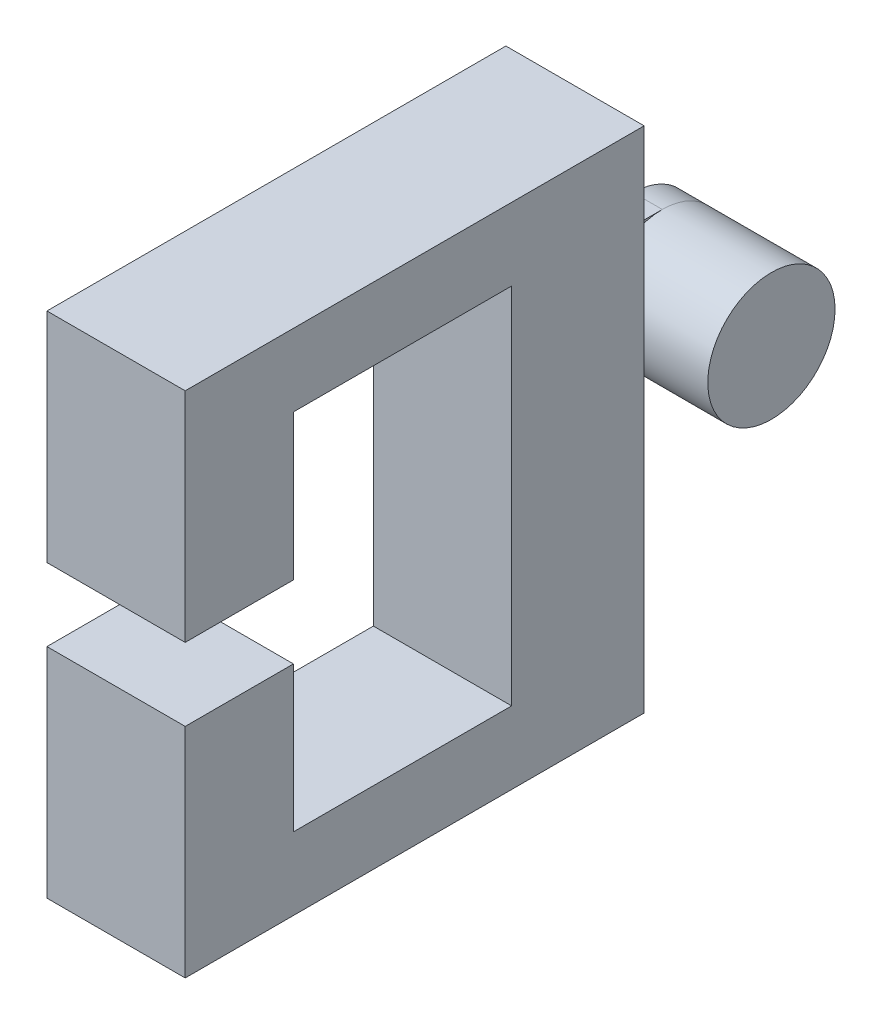
ISO-10303-21;
HEADER;
FILE_DESCRIPTION(('STEP AP214'),'2;1');
FILE_NAME('part.step','',(''),(''),'','','');
FILE_SCHEMA(('AUTOMOTIVE_DESIGN { 1 0 10303 214 1 1 1 1 }'));
ENDSEC;
DATA;
#1=APPLICATION_CONTEXT('core data for automotive mechanical design processes');
#2=APPLICATION_PROTOCOL_DEFINITION('international standard','automotive_design',2000,#1);
#3=PRODUCT_CONTEXT('',#1,'mechanical');
#4=PRODUCT('Part','Part','',(#3));
#5=PRODUCT_RELATED_PRODUCT_CATEGORY('part','',(#4));
#6=PRODUCT_DEFINITION_FORMATION('','',#4);
#7=PRODUCT_DEFINITION_CONTEXT('part definition',#1,'design');
#8=PRODUCT_DEFINITION('design','',#6,#7);
#9=PRODUCT_DEFINITION_SHAPE('','',#8);
#10=(LENGTH_UNIT() NAMED_UNIT(*) SI_UNIT(.MILLI.,.METRE.));
#11=(NAMED_UNIT(*) PLANE_ANGLE_UNIT() SI_UNIT($,.RADIAN.));
#12=(NAMED_UNIT(*) SI_UNIT($,.STERADIAN.) SOLID_ANGLE_UNIT());
#13=UNCERTAINTY_MEASURE_WITH_UNIT(LENGTH_MEASURE(1.E-05),#10,'distance_accuracy_value','');
#14=(GEOMETRIC_REPRESENTATION_CONTEXT(3) GLOBAL_UNCERTAINTY_ASSIGNED_CONTEXT((#13)) GLOBAL_UNIT_ASSIGNED_CONTEXT((#10,
#11,#12)) REPRESENTATION_CONTEXT('',''));
#15=CARTESIAN_POINT('',(0.,0.,0.));
#16=DIRECTION('',(0.,0.,1.));
#17=DIRECTION('',(1.,0.,0.));
#18=AXIS2_PLACEMENT_3D('',#15,#16,#17);
#19=CARTESIAN_POINT('',(-14.61643,-44.3992,23.139146));
#20=DIRECTION('',(0.,0.,1.));
#21=DIRECTION('',(1.,0.,0.));
#22=AXIS2_PLACEMENT_3D('',#19,#20,#21);
#23=PLANE('',#22);
#24=DIRECTION('',(1.,0.,0.));
#25=VECTOR('',#24,1.);
#26=CARTESIAN_POINT('',(-14.61643,31.75,23.139146));
#27=LINE('',#26,#25);
#28=CARTESIAN_POINT('',(-14.61643,31.75,23.139146));
#29=VERTEX_POINT('',#28);
#30=CARTESIAN_POINT('',(9.525,31.75,23.139146));
#31=VERTEX_POINT('',#30);
#32=EDGE_CURVE('E62',#29,#31,#27,.T.);
#33=ORIENTED_EDGE('',*,*,#32,.F.);
#34=DIRECTION('',(0.,-1.,0.));
#35=VECTOR('',#34,1.);
#36=CARTESIAN_POINT('',(-14.61643,-44.3992,23.139146));
#37=LINE('',#36,#35);
#38=CARTESIAN_POINT('',(-14.61643,-31.75,23.139146));
#39=VERTEX_POINT('',#38);
#40=EDGE_CURVE('E261',#29,#39,#37,.T.);
#41=ORIENTED_EDGE('',*,*,#40,.T.);
#42=DIRECTION('',(1.,0.,0.));
#43=VECTOR('',#42,1.);
#44=CARTESIAN_POINT('',(-14.61643,-31.75,23.139146));
#45=LINE('',#44,#43);
#46=CARTESIAN_POINT('',(9.525,-31.75,23.139146));
#47=VERTEX_POINT('',#46);
#48=EDGE_CURVE('E255',#39,#47,#45,.T.);
#49=ORIENTED_EDGE('',*,*,#48,.T.);
#50=DIRECTION('',(0.,-1.,0.));
#51=VECTOR('',#50,1.);
#52=CARTESIAN_POINT('',(9.525,-44.3992,23.139146));
#53=LINE('',#52,#51);
#54=EDGE_CURVE('E251',#31,#47,#53,.T.);
#55=ORIENTED_EDGE('',*,*,#54,.F.);
#56=EDGE_LOOP('',(#33,#41,#49,#55));
#57=FACE_BOUND('',#56,.T.);
#58=ADVANCED_FACE('F50',(#57),#23,.T.);
#59=CARTESIAN_POINT('',(-14.61643,-0.000127000000000807,-22.225762));
#60=DIRECTION('',(-1.,0.,0.));
#61=DIRECTION('',(0.,0.,1.));
#62=AXIS2_PLACEMENT_3D('',#59,#60,#61);
#63=CYLINDRICAL_SURFACE('',#62,11.112754);
#64=DIRECTION('',(-1.,0.,0.));
#65=VECTOR('',#64,1.);
#66=CARTESIAN_POINT('',(-14.61643,-0.000127000000000807,-33.338516));
#67=LINE('',#66,#65);
#68=CARTESIAN_POINT('',(-9.525,-0.00012699999999666,-33.3385159996372));
#69=VERTEX_POINT('',#68);
#70=CARTESIAN_POINT('',(-14.61643,-0.000127000000000807,-33.338516));
#71=VERTEX_POINT('',#70);
#72=EDGE_CURVE('E317',#69,#71,#67,.T.);
#73=ORIENTED_EDGE('',*,*,#72,.F.);
#74=CARTESIAN_POINT('',(-9.525,-0.000127000000000807,-22.225762));
#75=DIRECTION('',(1.,0.,0.));
#76=DIRECTION('',(0.,0.,-1.));
#77=AXIS2_PLACEMENT_3D('',#74,#75,#76);
#78=CIRCLE('',#77,11.112754);
#79=CARTESIAN_POINT('',(-9.525,-11.1128809996372,-22.225762));
#80=VERTEX_POINT('',#79);
#81=EDGE_CURVE('E54',#80,#69,#78,.T.);
#82=ORIENTED_EDGE('',*,*,#81,.F.);
#83=DIRECTION('',(-1.,0.,0.));
#84=VECTOR('',#83,1.);
#85=CARTESIAN_POINT('',(-14.61643,-11.112881,-22.225762));
#86=LINE('',#85,#84);
#87=CARTESIAN_POINT('',(-14.61643,-11.112881,-22.225762));
#88=VERTEX_POINT('',#87);
#89=EDGE_CURVE('E313',#88,#80,#86,.F.);
#90=ORIENTED_EDGE('',*,*,#89,.F.);
#91=CARTESIAN_POINT('',(-14.61643,-0.000127000000000807,-22.225762));
#92=DIRECTION('',(1.,0.,0.));
#93=DIRECTION('',(0.,0.,-1.));
#94=AXIS2_PLACEMENT_3D('',#91,#92,#93);
#95=CIRCLE('',#94,11.112754);
#96=EDGE_CURVE('E11',#71,#88,#95,.F.);
#97=ORIENTED_EDGE('',*,*,#96,.F.);
#98=EDGE_LOOP('',(#73,#82,#90,#97));
#99=FACE_BOUND('',#98,.T.);
#100=ADVANCED_FACE('F47',(#99),#63,.T.);
#101=CARTESIAN_POINT('',(-14.61643,0.000127000000000807,-22.225762));
#102=DIRECTION('',(-1.,0.,0.));
#103=DIRECTION('',(0.,0.,1.));
#104=AXIS2_PLACEMENT_3D('',#101,#102,#103);
#105=CYLINDRICAL_SURFACE('',#104,11.112754);
#106=DIRECTION('',(1.,0.,0.));
#107=VECTOR('',#106,1.);
#108=CARTESIAN_POINT('',(-14.61643,0.000127000000000807,-33.338516));
#109=LINE('',#108,#107);
#110=CARTESIAN_POINT('',(-14.61643,0.000127000000000807,-33.338516));
#111=VERTEX_POINT('',#110);
#112=CARTESIAN_POINT('',(-9.525,0.00012699999999666,-33.3385159996372));
#113=VERTEX_POINT('',#112);
#114=EDGE_CURVE('E360',#111,#113,#109,.T.);
#115=ORIENTED_EDGE('',*,*,#114,.F.);
#116=CARTESIAN_POINT('',(-14.61643,0.000127000000000807,-22.225762));
#117=DIRECTION('',(1.,0.,0.));
#118=DIRECTION('',(0.,0.,-1.));
#119=AXIS2_PLACEMENT_3D('',#116,#117,#118);
#120=CIRCLE('',#119,11.112754);
#121=CARTESIAN_POINT('',(-14.61643,11.112881,-22.225762));
#122=VERTEX_POINT('',#121);
#123=EDGE_CURVE('E328',#122,#111,#120,.F.);
#124=ORIENTED_EDGE('',*,*,#123,.F.);
#125=DIRECTION('',(1.,0.,0.));
#126=VECTOR('',#125,1.);
#127=CARTESIAN_POINT('',(-14.61643,11.112881,-22.225762));
#128=LINE('',#127,#126);
#129=CARTESIAN_POINT('',(-9.525,11.1128809996372,-22.225762));
#130=VERTEX_POINT('',#129);
#131=EDGE_CURVE('E363',#130,#122,#128,.F.);
#132=ORIENTED_EDGE('',*,*,#131,.F.);
#133=CARTESIAN_POINT('',(-9.525,0.000127000000000807,-22.225762));
#134=DIRECTION('',(1.,0.,0.));
#135=DIRECTION('',(0.,0.,-1.));
#136=AXIS2_PLACEMENT_3D('',#133,#134,#135);
#137=CIRCLE('',#136,11.112754);
#138=EDGE_CURVE('E321',#113,#130,#137,.T.);
#139=ORIENTED_EDGE('',*,*,#138,.F.);
#140=EDGE_LOOP('',(#115,#124,#132,#139));
#141=FACE_BOUND('',#140,.T.);
#142=ADVANCED_FACE('F373',(#141),#105,.T.);
#143=CARTESIAN_POINT('',(9.525,0.,-22.225635));
#144=DIRECTION('',(-1.,0.,0.));
#145=DIRECTION('',(0.,0.,1.));
#146=AXIS2_PLACEMENT_3D('',#143,#144,#145);
#147=CYLINDRICAL_SURFACE('',#146,11.112881);
#148=CARTESIAN_POINT('',(9.525,0.,-22.225635));
#149=DIRECTION('',(1.,0.,0.));
#150=DIRECTION('',(0.,0.,-1.));
#151=AXIS2_PLACEMENT_3D('',#148,#149,#150);
#152=CIRCLE('',#151,11.112881);
#153=CARTESIAN_POINT('',(9.525,0.,-33.338516));
#154=VERTEX_POINT('',#153);
#155=EDGE_CURVE('E350',#154,#154,#152,.T.);
#156=ORIENTED_EDGE('',*,*,#155,.F.);
#157=EDGE_LOOP('',(#156));
#158=FACE_BOUND('',#157,.T.);
#159=DIRECTION('',(0.,1.,0.));
#160=VECTOR('',#159,1.);
#161=CARTESIAN_POINT('',(-9.525,-11.112881,-33.338516));
#162=LINE('',#161,#160);
#163=CARTESIAN_POINT('',(-9.525,0.,-33.338516));
#164=VERTEX_POINT('',#163);
#165=EDGE_CURVE('E304',#164,#113,#162,.T.);
#166=ORIENTED_EDGE('',*,*,#165,.T.);
#167=CARTESIAN_POINT('',(-9.525,0.,-22.225635));
#168=DIRECTION('',(1.,0.,0.));
#169=DIRECTION('',(0.,0.,-1.));
#170=AXIS2_PLACEMENT_3D('',#167,#168,#169);
#171=CIRCLE('',#170,11.112881);
#172=EDGE_CURVE('E348',#113,#130,#171,.T.);
#173=ORIENTED_EDGE('',*,*,#172,.T.);
#174=DIRECTION('',(0.,0.,-1.));
#175=VECTOR('',#174,1.);
#176=CARTESIAN_POINT('',(-9.525,11.112881,0.));
#177=LINE('',#176,#175);
#178=CARTESIAN_POINT('',(-9.525,11.112881,-22.225635));
#179=VERTEX_POINT('',#178);
#180=EDGE_CURVE('E337',#179,#130,#177,.T.);
#181=ORIENTED_EDGE('',*,*,#180,.F.);
#182=CARTESIAN_POINT('',(-9.525,-11.112881,-22.225635));
#183=VERTEX_POINT('',#182);
#184=EDGE_CURVE('E338',#179,#183,#171,.T.);
#185=ORIENTED_EDGE('',*,*,#184,.T.);
#186=DIRECTION('',(0.,0.,-1.));
#187=VECTOR('',#186,1.);
#188=CARTESIAN_POINT('',(-9.525,-11.112881,0.));
#189=LINE('',#188,#187);
#190=EDGE_CURVE('E297',#183,#80,#189,.T.);
#191=ORIENTED_EDGE('',*,*,#190,.T.);
#192=EDGE_CURVE('E340',#80,#69,#171,.T.);
#193=ORIENTED_EDGE('',*,*,#192,.T.);
#194=EDGE_CURVE('E333',#69,#164,#162,.T.);
#195=ORIENTED_EDGE('',*,*,#194,.T.);
#196=EDGE_LOOP('',(#166,#173,#181,#185,#191,#193,#195));
#197=FACE_BOUND('',#196,.T.);
#198=ADVANCED_FACE('F369',(#158,#197),#147,.T.);
#199=CARTESIAN_POINT('',(9.525,0.,-22.225635));
#200=DIRECTION('',(1.,0.,0.));
#201=DIRECTION('',(0.,0.,-1.));
#202=AXIS2_PLACEMENT_3D('',#199,#200,#201);
#203=PLANE('',#202);
#204=ORIENTED_EDGE('',*,*,#155,.T.);
#205=EDGE_LOOP('',(#204));
#206=FACE_BOUND('',#205,.T.);
#207=ADVANCED_FACE('F368',(#206),#203,.T.);
#208=CARTESIAN_POINT('',(-9.525,0.,0.));
#209=DIRECTION('',(1.,0.,0.));
#210=DIRECTION('',(0.,0.,-1.));
#211=AXIS2_PLACEMENT_3D('',#208,#209,#210);
#212=PLANE('',#211);
#213=ORIENTED_EDGE('',*,*,#172,.F.);
#214=ORIENTED_EDGE('',*,*,#138,.T.);
#215=EDGE_LOOP('',(#213,#214));
#216=FACE_BOUND('',#215,.T.);
#217=ADVANCED_FACE('F388',(#216),#212,.T.);
#218=ORIENTED_EDGE('',*,*,#184,.F.);
#219=CARTESIAN_POINT('',(-9.525,11.112881,0.));
#220=VERTEX_POINT('',#219);
#221=EDGE_CURVE('E291',#220,#179,#177,.T.);
#222=ORIENTED_EDGE('',*,*,#221,.F.);
#223=DIRECTION('',(0.,-1.,0.));
#224=VECTOR('',#223,1.);
#225=CARTESIAN_POINT('',(-9.525,11.112881,0.));
#226=LINE('',#225,#224);
#227=CARTESIAN_POINT('',(-9.525,-11.112881,0.));
#228=VERTEX_POINT('',#227);
#229=EDGE_CURVE('E290',#220,#228,#226,.T.);
#230=ORIENTED_EDGE('',*,*,#229,.T.);
#231=EDGE_CURVE('E301',#228,#183,#189,.T.);
#232=ORIENTED_EDGE('',*,*,#231,.T.);
#233=EDGE_LOOP('',(#218,#222,#230,#232));
#234=FACE_BOUND('',#233,.T.);
#235=ADVANCED_FACE('F393',(#234),#212,.T.);
#236=ORIENTED_EDGE('',*,*,#192,.F.);
#237=ORIENTED_EDGE('',*,*,#81,.T.);
#238=EDGE_LOOP('',(#236,#237));
#239=FACE_BOUND('',#238,.T.);
#240=ADVANCED_FACE('F378',(#239),#212,.T.);
#241=CARTESIAN_POINT('',(-14.61643,11.112881,0.));
#242=DIRECTION('',(0.,-1.,0.));
#243=DIRECTION('',(0.,0.,-1.));
#244=AXIS2_PLACEMENT_3D('',#241,#242,#243);
#245=PLANE('',#244);
#246=ORIENTED_EDGE('',*,*,#180,.T.);
#247=ORIENTED_EDGE('',*,*,#131,.T.);
#248=DIRECTION('',(0.,0.,-1.));
#249=VECTOR('',#248,1.);
#250=CARTESIAN_POINT('',(-14.61643,11.112881,0.));
#251=LINE('',#250,#249);
#252=CARTESIAN_POINT('',(-14.61643,11.112881,0.));
#253=VERTEX_POINT('',#252);
#254=EDGE_CURVE('E294',#253,#122,#251,.T.);
#255=ORIENTED_EDGE('',*,*,#254,.F.);
#256=DIRECTION('',(1.,0.,0.));
#257=VECTOR('',#256,1.);
#258=CARTESIAN_POINT('',(-14.61643,11.112881,0.));
#259=LINE('',#258,#257);
#260=EDGE_CURVE('E341',#253,#220,#259,.T.);
#261=ORIENTED_EDGE('',*,*,#260,.T.);
#262=ORIENTED_EDGE('',*,*,#221,.T.);
#263=EDGE_LOOP('',(#246,#247,#255,#261,#262));
#264=FACE_BOUND('',#263,.T.);
#265=ADVANCED_FACE('F404',(#264),#245,.F.);
#266=CARTESIAN_POINT('',(-14.61643,-11.112881,-33.338516));
#267=DIRECTION('',(0.,0.,-1.));
#268=DIRECTION('',(-1.,0.,0.));
#269=AXIS2_PLACEMENT_3D('',#266,#267,#268);
#270=PLANE('',#269);
#271=ORIENTED_EDGE('',*,*,#194,.F.);
#272=ORIENTED_EDGE('',*,*,#72,.T.);
#273=DIRECTION('',(0.,1.,0.));
#274=VECTOR('',#273,1.);
#275=CARTESIAN_POINT('',(-14.61643,-11.112881,-33.338516));
#276=LINE('',#275,#274);
#277=EDGE_CURVE('E292',#71,#111,#276,.T.);
#278=ORIENTED_EDGE('',*,*,#277,.T.);
#279=ORIENTED_EDGE('',*,*,#114,.T.);
#280=ORIENTED_EDGE('',*,*,#165,.F.);
#281=EDGE_LOOP('',(#271,#272,#278,#279,#280));
#282=FACE_BOUND('',#281,.T.);
#283=ADVANCED_FACE('F376',(#282),#270,.T.);
#284=CARTESIAN_POINT('',(-14.61643,-11.112881,0.));
#285=DIRECTION('',(0.,-1.,0.));
#286=DIRECTION('',(0.,0.,-1.));
#287=AXIS2_PLACEMENT_3D('',#284,#285,#286);
#288=PLANE('',#287);
#289=DIRECTION('',(0.,0.,-1.));
#290=VECTOR('',#289,1.);
#291=CARTESIAN_POINT('',(-14.61643,-11.112881,0.));
#292=LINE('',#291,#290);
#293=CARTESIAN_POINT('',(-14.61643,-11.112881,0.));
#294=VERTEX_POINT('',#293);
#295=EDGE_CURVE('E288',#294,#88,#292,.T.);
#296=ORIENTED_EDGE('',*,*,#295,.T.);
#297=ORIENTED_EDGE('',*,*,#89,.T.);
#298=ORIENTED_EDGE('',*,*,#190,.F.);
#299=ORIENTED_EDGE('',*,*,#231,.F.);
#300=DIRECTION('',(1.,0.,0.));
#301=VECTOR('',#300,1.);
#302=CARTESIAN_POINT('',(-14.61643,-11.112881,0.));
#303=LINE('',#302,#301);
#304=EDGE_CURVE('E296',#294,#228,#303,.T.);
#305=ORIENTED_EDGE('',*,*,#304,.F.);
#306=EDGE_LOOP('',(#296,#297,#298,#299,#305));
#307=FACE_BOUND('',#306,.T.);
#308=ADVANCED_FACE('F414',(#307),#288,.T.);
#309=CARTESIAN_POINT('',(-14.61643,0.,0.));
#310=DIRECTION('',(1.,0.,0.));
#311=DIRECTION('',(0.,0.,-1.));
#312=AXIS2_PLACEMENT_3D('',#309,#310,#311);
#313=PLANE('',#312);
#314=ORIENTED_EDGE('',*,*,#277,.F.);
#315=ORIENTED_EDGE('',*,*,#96,.T.);
#316=ORIENTED_EDGE('',*,*,#295,.F.);
#317=DIRECTION('',(0.,1.,0.));
#318=VECTOR('',#317,1.);
#319=CARTESIAN_POINT('',(-14.61643,-44.3992,0.));
#320=LINE('',#319,#318);
#321=CARTESIAN_POINT('',(-14.61643,-44.3992,0.));
#322=VERTEX_POINT('',#321);
#323=EDGE_CURVE('E269',#322,#294,#320,.T.);
#324=ORIENTED_EDGE('',*,*,#323,.F.);
#325=DIRECTION('',(0.,0.,-1.));
#326=VECTOR('',#325,1.);
#327=CARTESIAN_POINT('',(-14.61643,-44.3992,23.139146));
#328=LINE('',#327,#326);
#329=CARTESIAN_POINT('',(-14.61643,-44.3992,80.138524));
#330=VERTEX_POINT('',#329);
#331=EDGE_CURVE('E264',#330,#322,#328,.T.);
#332=ORIENTED_EDGE('',*,*,#331,.F.);
#333=DIRECTION('',(0.,-1.,0.));
#334=VECTOR('',#333,1.);
#335=CARTESIAN_POINT('',(-14.61643,-44.3992,80.138524));
#336=LINE('',#335,#334);
#337=CARTESIAN_POINT('',(-14.61643,-6.35,80.138524));
#338=VERTEX_POINT('',#337);
#339=EDGE_CURVE('E232',#338,#330,#336,.T.);
#340=ORIENTED_EDGE('',*,*,#339,.F.);
#341=DIRECTION('',(0.,0.,1.));
#342=VECTOR('',#341,1.);
#343=CARTESIAN_POINT('',(-14.61643,-6.35,80.138524));
#344=LINE('',#343,#342);
#345=CARTESIAN_POINT('',(-14.61643,-6.35,61.239146));
#346=VERTEX_POINT('',#345);
#347=EDGE_CURVE('E224',#346,#338,#344,.T.);
#348=ORIENTED_EDGE('',*,*,#347,.F.);
#349=DIRECTION('',(0.,1.,0.));
#350=VECTOR('',#349,1.);
#351=CARTESIAN_POINT('',(-14.61643,-44.3992,61.239146));
#352=LINE('',#351,#350);
#353=CARTESIAN_POINT('',(-14.61643,-31.75,61.239146));
#354=VERTEX_POINT('',#353);
#355=EDGE_CURVE('E241',#354,#346,#352,.T.);
#356=ORIENTED_EDGE('',*,*,#355,.F.);
#357=DIRECTION('',(0.,0.,-1.));
#358=VECTOR('',#357,1.);
#359=CARTESIAN_POINT('',(-14.61643,-31.75,0.));
#360=LINE('',#359,#358);
#361=EDGE_CURVE('E257',#354,#39,#360,.T.);
#362=ORIENTED_EDGE('',*,*,#361,.T.);
#363=ORIENTED_EDGE('',*,*,#40,.F.);
#364=DIRECTION('',(0.,0.,-1.));
#365=VECTOR('',#364,1.);
#366=CARTESIAN_POINT('',(-14.61643,31.75,0.));
#367=LINE('',#366,#365);
#368=CARTESIAN_POINT('',(-14.61643,31.75,61.239146));
#369=VERTEX_POINT('',#368);
#370=EDGE_CURVE('E244',#369,#29,#367,.T.);
#371=ORIENTED_EDGE('',*,*,#370,.F.);
#372=DIRECTION('',(0.,1.,0.));
#373=VECTOR('',#372,1.);
#374=CARTESIAN_POINT('',(-14.61643,6.35,61.239146));
#375=LINE('',#374,#373);
#376=CARTESIAN_POINT('',(-14.61643,6.35,61.239146));
#377=VERTEX_POINT('',#376);
#378=EDGE_CURVE('E193',#377,#369,#375,.T.);
#379=ORIENTED_EDGE('',*,*,#378,.F.);
#380=DIRECTION('',(0.,0.,-1.));
#381=VECTOR('',#380,1.);
#382=CARTESIAN_POINT('',(-14.61643,6.35,80.138524));
#383=LINE('',#382,#381);
#384=CARTESIAN_POINT('',(-14.61643,6.35,80.138524));
#385=VERTEX_POINT('',#384);
#386=EDGE_CURVE('E187',#385,#377,#383,.T.);
#387=ORIENTED_EDGE('',*,*,#386,.F.);
#388=DIRECTION('',(0.,-1.,0.));
#389=VECTOR('',#388,1.);
#390=CARTESIAN_POINT('',(-14.61643,6.35,80.138524));
#391=LINE('',#390,#389);
#392=CARTESIAN_POINT('',(-14.61643,44.3992,80.138524));
#393=VERTEX_POINT('',#392);
#394=EDGE_CURVE('E205',#393,#385,#391,.T.);
#395=ORIENTED_EDGE('',*,*,#394,.F.);
#396=DIRECTION('',(0.,0.,1.));
#397=VECTOR('',#396,1.);
#398=CARTESIAN_POINT('',(-14.61643,44.3992,23.139146));
#399=LINE('',#398,#397);
#400=CARTESIAN_POINT('',(-14.61643,44.3992,0.));
#401=VERTEX_POINT('',#400);
#402=EDGE_CURVE('E271',#401,#393,#399,.T.);
#403=ORIENTED_EDGE('',*,*,#402,.F.);
#404=EDGE_CURVE('E268',#253,#401,#320,.T.);
#405=ORIENTED_EDGE('',*,*,#404,.F.);
#406=ORIENTED_EDGE('',*,*,#254,.T.);
#407=ORIENTED_EDGE('',*,*,#123,.T.);
#408=EDGE_LOOP('',(#314,#315,#316,#324,#332,#340,#348,#356,#362,#363,#371,#379,#387,#395,#403,
#405,#406,#407));
#409=FACE_BOUND('',#408,.T.);
#410=ADVANCED_FACE('F199',(#409),#313,.F.);
#411=CARTESIAN_POINT('',(-14.61643,-44.3992,0.));
#412=DIRECTION('',(0.,0.,-1.));
#413=DIRECTION('',(-1.,0.,0.));
#414=AXIS2_PLACEMENT_3D('',#411,#412,#413);
#415=PLANE('',#414);
#416=ORIENTED_EDGE('',*,*,#260,.F.);
#417=ORIENTED_EDGE('',*,*,#404,.T.);
#418=DIRECTION('',(1.,0.,0.));
#419=VECTOR('',#418,1.);
#420=CARTESIAN_POINT('',(-14.61643,44.3992,0.));
#421=LINE('',#420,#419);
#422=CARTESIAN_POINT('',(9.525,44.3992,0.));
#423=VERTEX_POINT('',#422);
#424=EDGE_CURVE('E284',#401,#423,#421,.T.);
#425=ORIENTED_EDGE('',*,*,#424,.T.);
#426=DIRECTION('',(0.,1.,0.));
#427=VECTOR('',#426,1.);
#428=CARTESIAN_POINT('',(9.525,-44.3992,0.));
#429=LINE('',#428,#427);
#430=CARTESIAN_POINT('',(9.525,-44.3992,0.));
#431=VERTEX_POINT('',#430);
#432=EDGE_CURVE('E283',#431,#423,#429,.T.);
#433=ORIENTED_EDGE('',*,*,#432,.F.);
#434=DIRECTION('',(1.,0.,0.));
#435=VECTOR('',#434,1.);
#436=CARTESIAN_POINT('',(-14.61643,-44.3992,0.));
#437=LINE('',#436,#435);
#438=EDGE_CURVE('E273',#322,#431,#437,.T.);
#439=ORIENTED_EDGE('',*,*,#438,.F.);
#440=ORIENTED_EDGE('',*,*,#323,.T.);
#441=ORIENTED_EDGE('',*,*,#304,.T.);
#442=ORIENTED_EDGE('',*,*,#229,.F.);
#443=EDGE_LOOP('',(#416,#417,#425,#433,#439,#440,#441,#442));
#444=FACE_BOUND('',#443,.T.);
#445=ADVANCED_FACE('F412',(#444),#415,.T.);
#446=CARTESIAN_POINT('',(-14.61643,44.3992,23.139146));
#447=DIRECTION('',(0.,1.,0.));
#448=DIRECTION('',(0.,0.,1.));
#449=AXIS2_PLACEMENT_3D('',#446,#447,#448);
#450=PLANE('',#449);
#451=DIRECTION('',(0.,0.,1.));
#452=VECTOR('',#451,1.);
#453=CARTESIAN_POINT('',(9.525,44.3992,23.139146));
#454=LINE('',#453,#452);
#455=CARTESIAN_POINT('',(9.525,44.3992,80.138524));
#456=VERTEX_POINT('',#455);
#457=EDGE_CURVE('E266',#423,#456,#454,.T.);
#458=ORIENTED_EDGE('',*,*,#457,.F.);
#459=ORIENTED_EDGE('',*,*,#424,.F.);
#460=ORIENTED_EDGE('',*,*,#402,.T.);
#461=DIRECTION('',(1.,0.,0.));
#462=VECTOR('',#461,1.);
#463=CARTESIAN_POINT('',(-14.61643,44.3992,80.138524));
#464=LINE('',#463,#462);
#465=EDGE_CURVE('E209',#393,#456,#464,.T.);
#466=ORIENTED_EDGE('',*,*,#465,.T.);
#467=EDGE_LOOP('',(#458,#459,#460,#466));
#468=FACE_BOUND('',#467,.T.);
#469=ADVANCED_FACE('F418',(#468),#450,.T.);
#470=CARTESIAN_POINT('',(-14.61643,-44.3992,23.139146));
#471=DIRECTION('',(0.,-1.,0.));
#472=DIRECTION('',(0.,0.,-1.));
#473=AXIS2_PLACEMENT_3D('',#470,#471,#472);
#474=PLANE('',#473);
#475=DIRECTION('',(0.,0.,-1.));
#476=VECTOR('',#475,1.);
#477=CARTESIAN_POINT('',(9.525,-44.3992,23.139146));
#478=LINE('',#477,#476);
#479=CARTESIAN_POINT('',(9.525,-44.3992,80.138524));
#480=VERTEX_POINT('',#479);
#481=EDGE_CURVE('E279',#480,#431,#478,.T.);
#482=ORIENTED_EDGE('',*,*,#481,.F.);
#483=DIRECTION('',(1.,0.,0.));
#484=VECTOR('',#483,1.);
#485=CARTESIAN_POINT('',(-14.61643,-44.3992,80.138524));
#486=LINE('',#485,#484);
#487=EDGE_CURVE('E225',#330,#480,#486,.T.);
#488=ORIENTED_EDGE('',*,*,#487,.F.);
#489=ORIENTED_EDGE('',*,*,#331,.T.);
#490=ORIENTED_EDGE('',*,*,#438,.T.);
#491=EDGE_LOOP('',(#482,#488,#489,#490));
#492=FACE_BOUND('',#491,.T.);
#493=ADVANCED_FACE('F415',(#492),#474,.T.);
#494=CARTESIAN_POINT('',(9.525,0.,0.));
#495=DIRECTION('',(-1.,0.,0.));
#496=DIRECTION('',(0.,0.,1.));
#497=AXIS2_PLACEMENT_3D('',#494,#495,#496);
#498=PLANE('',#497);
#499=ORIENTED_EDGE('',*,*,#457,.T.);
#500=DIRECTION('',(0.,-1.,0.));
#501=VECTOR('',#500,1.);
#502=CARTESIAN_POINT('',(9.525,6.35,80.138524));
#503=LINE('',#502,#501);
#504=CARTESIAN_POINT('',(9.525,6.35,80.138524));
#505=VERTEX_POINT('',#504);
#506=EDGE_CURVE('E218',#456,#505,#503,.T.);
#507=ORIENTED_EDGE('',*,*,#506,.T.);
#508=DIRECTION('',(0.,0.,-1.));
#509=VECTOR('',#508,1.);
#510=CARTESIAN_POINT('',(9.525,6.35,80.138524));
#511=LINE('',#510,#509);
#512=CARTESIAN_POINT('',(9.525,6.35,61.239146));
#513=VERTEX_POINT('',#512);
#514=EDGE_CURVE('E189',#505,#513,#511,.T.);
#515=ORIENTED_EDGE('',*,*,#514,.T.);
#516=DIRECTION('',(0.,1.,0.));
#517=VECTOR('',#516,1.);
#518=CARTESIAN_POINT('',(9.525,6.35,61.239146));
#519=LINE('',#518,#517);
#520=CARTESIAN_POINT('',(9.525,31.75,61.239146));
#521=VERTEX_POINT('',#520);
#522=EDGE_CURVE('E208',#513,#521,#519,.T.);
#523=ORIENTED_EDGE('',*,*,#522,.T.);
#524=DIRECTION('',(0.,0.,-1.));
#525=VECTOR('',#524,1.);
#526=CARTESIAN_POINT('',(9.525,31.75,0.));
#527=LINE('',#526,#525);
#528=EDGE_CURVE('E248',#521,#31,#527,.T.);
#529=ORIENTED_EDGE('',*,*,#528,.T.);
#530=ORIENTED_EDGE('',*,*,#54,.T.);
#531=DIRECTION('',(0.,0.,-1.));
#532=VECTOR('',#531,1.);
#533=CARTESIAN_POINT('',(9.525,-31.75,0.));
#534=LINE('',#533,#532);
#535=CARTESIAN_POINT('',(9.525,-31.75,61.239146));
#536=VERTEX_POINT('',#535);
#537=EDGE_CURVE('E69',#536,#47,#534,.T.);
#538=ORIENTED_EDGE('',*,*,#537,.F.);
#539=DIRECTION('',(0.,1.,0.));
#540=VECTOR('',#539,1.);
#541=CARTESIAN_POINT('',(9.525,-44.3992,61.239146));
#542=LINE('',#541,#540);
#543=CARTESIAN_POINT('',(9.525,-6.35,61.239146));
#544=VERTEX_POINT('',#543);
#545=EDGE_CURVE('E234',#536,#544,#542,.T.);
#546=ORIENTED_EDGE('',*,*,#545,.T.);
#547=DIRECTION('',(0.,0.,1.));
#548=VECTOR('',#547,1.);
#549=CARTESIAN_POINT('',(9.525,-6.35,80.138524));
#550=LINE('',#549,#548);
#551=CARTESIAN_POINT('',(9.525,-6.35,80.138524));
#552=VERTEX_POINT('',#551);
#553=EDGE_CURVE('E233',#544,#552,#550,.T.);
#554=ORIENTED_EDGE('',*,*,#553,.T.);
#555=DIRECTION('',(0.,-1.,0.));
#556=VECTOR('',#555,1.);
#557=CARTESIAN_POINT('',(9.525,-44.3992,80.138524));
#558=LINE('',#557,#556);
#559=EDGE_CURVE('E216',#552,#480,#558,.T.);
#560=ORIENTED_EDGE('',*,*,#559,.T.);
#561=ORIENTED_EDGE('',*,*,#481,.T.);
#562=ORIENTED_EDGE('',*,*,#432,.T.);
#563=EDGE_LOOP('',(#499,#507,#515,#523,#529,#530,#538,#546,#554,#560,#561,#562));
#564=FACE_BOUND('',#563,.T.);
#565=ADVANCED_FACE('F517',(#564),#498,.F.);
#566=CARTESIAN_POINT('',(-14.61643,-31.75,0.));
#567=DIRECTION('',(0.,-1.,0.));
#568=DIRECTION('',(0.,0.,-1.));
#569=AXIS2_PLACEMENT_3D('',#566,#567,#568);
#570=PLANE('',#569);
#571=ORIENTED_EDGE('',*,*,#537,.T.);
#572=ORIENTED_EDGE('',*,*,#48,.F.);
#573=ORIENTED_EDGE('',*,*,#361,.F.);
#574=DIRECTION('',(1.,0.,0.));
#575=VECTOR('',#574,1.);
#576=CARTESIAN_POINT('',(-14.61643,-31.75,61.239146));
#577=LINE('',#576,#575);
#578=EDGE_CURVE('E258',#354,#536,#577,.T.);
#579=ORIENTED_EDGE('',*,*,#578,.T.);
#580=EDGE_LOOP('',(#571,#572,#573,#579));
#581=FACE_BOUND('',#580,.T.);
#582=ADVANCED_FACE('F527',(#581),#570,.F.);
#583=CARTESIAN_POINT('',(-14.61643,31.75,0.));
#584=DIRECTION('',(0.,-1.,0.));
#585=DIRECTION('',(0.,0.,-1.));
#586=AXIS2_PLACEMENT_3D('',#583,#584,#585);
#587=PLANE('',#586);
#588=ORIENTED_EDGE('',*,*,#528,.F.);
#589=DIRECTION('',(1.,0.,0.));
#590=VECTOR('',#589,1.);
#591=CARTESIAN_POINT('',(-14.61643,31.75,61.239146));
#592=LINE('',#591,#590);
#593=EDGE_CURVE('E247',#369,#521,#592,.T.);
#594=ORIENTED_EDGE('',*,*,#593,.F.);
#595=ORIENTED_EDGE('',*,*,#370,.T.);
#596=ORIENTED_EDGE('',*,*,#32,.T.);
#597=EDGE_LOOP('',(#588,#594,#595,#596));
#598=FACE_BOUND('',#597,.T.);
#599=ADVANCED_FACE('F541',(#598),#587,.T.);
#600=CARTESIAN_POINT('',(-14.61643,6.35,80.138524));
#601=DIRECTION('',(0.,0.,1.));
#602=DIRECTION('',(1.,0.,0.));
#603=AXIS2_PLACEMENT_3D('',#600,#601,#602);
#604=PLANE('',#603);
#605=ORIENTED_EDGE('',*,*,#506,.F.);
#606=ORIENTED_EDGE('',*,*,#465,.F.);
#607=ORIENTED_EDGE('',*,*,#394,.T.);
#608=DIRECTION('',(1.,0.,0.));
#609=VECTOR('',#608,1.);
#610=CARTESIAN_POINT('',(-14.61643,6.35,80.138524));
#611=LINE('',#610,#609);
#612=EDGE_CURVE('E182',#385,#505,#611,.T.);
#613=ORIENTED_EDGE('',*,*,#612,.T.);
#614=EDGE_LOOP('',(#605,#606,#607,#613));
#615=FACE_BOUND('',#614,.T.);
#616=ADVANCED_FACE('F210',(#615),#604,.T.);
#617=CARTESIAN_POINT('',(-14.61643,6.35,61.239146));
#618=DIRECTION('',(0.,0.,-1.));
#619=DIRECTION('',(-1.,0.,0.));
#620=AXIS2_PLACEMENT_3D('',#617,#618,#619);
#621=PLANE('',#620);
#622=ORIENTED_EDGE('',*,*,#378,.T.);
#623=ORIENTED_EDGE('',*,*,#593,.T.);
#624=ORIENTED_EDGE('',*,*,#522,.F.);
#625=DIRECTION('',(1.,0.,0.));
#626=VECTOR('',#625,1.);
#627=CARTESIAN_POINT('',(-14.61643,6.35,61.239146));
#628=LINE('',#627,#626);
#629=EDGE_CURVE('E194',#377,#513,#628,.T.);
#630=ORIENTED_EDGE('',*,*,#629,.F.);
#631=EDGE_LOOP('',(#622,#623,#624,#630));
#632=FACE_BOUND('',#631,.T.);
#633=ADVANCED_FACE('F557',(#632),#621,.T.);
#634=CARTESIAN_POINT('',(-14.61643,6.35,80.138524));
#635=DIRECTION('',(0.,-1.,0.));
#636=DIRECTION('',(0.,0.,-1.));
#637=AXIS2_PLACEMENT_3D('',#634,#635,#636);
#638=PLANE('',#637);
#639=ORIENTED_EDGE('',*,*,#514,.F.);
#640=ORIENTED_EDGE('',*,*,#612,.F.);
#641=ORIENTED_EDGE('',*,*,#386,.T.);
#642=ORIENTED_EDGE('',*,*,#629,.T.);
#643=EDGE_LOOP('',(#639,#640,#641,#642));
#644=FACE_BOUND('',#643,.T.);
#645=ADVANCED_FACE('F184',(#644),#638,.T.);
#646=CARTESIAN_POINT('',(-14.61643,-44.3992,61.239146));
#647=DIRECTION('',(0.,0.,-1.));
#648=DIRECTION('',(-1.,0.,0.));
#649=AXIS2_PLACEMENT_3D('',#646,#647,#648);
#650=PLANE('',#649);
#651=ORIENTED_EDGE('',*,*,#578,.F.);
#652=ORIENTED_EDGE('',*,*,#355,.T.);
#653=DIRECTION('',(1.,0.,0.));
#654=VECTOR('',#653,1.);
#655=CARTESIAN_POINT('',(-14.61643,-6.35,61.239146));
#656=LINE('',#655,#654);
#657=EDGE_CURVE('E228',#346,#544,#656,.T.);
#658=ORIENTED_EDGE('',*,*,#657,.T.);
#659=ORIENTED_EDGE('',*,*,#545,.F.);
#660=EDGE_LOOP('',(#651,#652,#658,#659));
#661=FACE_BOUND('',#660,.T.);
#662=ADVANCED_FACE('F580',(#661),#650,.T.);
#663=CARTESIAN_POINT('',(-14.61643,-44.3992,80.138524));
#664=DIRECTION('',(0.,0.,1.));
#665=DIRECTION('',(1.,0.,0.));
#666=AXIS2_PLACEMENT_3D('',#663,#664,#665);
#667=PLANE('',#666);
#668=ORIENTED_EDGE('',*,*,#559,.F.);
#669=DIRECTION('',(1.,0.,0.));
#670=VECTOR('',#669,1.);
#671=CARTESIAN_POINT('',(-14.61643,-6.35,80.138524));
#672=LINE('',#671,#670);
#673=EDGE_CURVE('E230',#338,#552,#672,.T.);
#674=ORIENTED_EDGE('',*,*,#673,.F.);
#675=ORIENTED_EDGE('',*,*,#339,.T.);
#676=ORIENTED_EDGE('',*,*,#487,.T.);
#677=EDGE_LOOP('',(#668,#674,#675,#676));
#678=FACE_BOUND('',#677,.T.);
#679=ADVANCED_FACE('F585',(#678),#667,.T.);
#680=CARTESIAN_POINT('',(-14.61643,-6.35,80.138524));
#681=DIRECTION('',(0.,1.,0.));
#682=DIRECTION('',(0.,0.,1.));
#683=AXIS2_PLACEMENT_3D('',#680,#681,#682);
#684=PLANE('',#683);
#685=ORIENTED_EDGE('',*,*,#553,.F.);
#686=ORIENTED_EDGE('',*,*,#657,.F.);
#687=ORIENTED_EDGE('',*,*,#347,.T.);
#688=ORIENTED_EDGE('',*,*,#673,.T.);
#689=EDGE_LOOP('',(#685,#686,#687,#688));
#690=FACE_BOUND('',#689,.T.);
#691=ADVANCED_FACE('F593',(#690),#684,.T.);
#692=CLOSED_SHELL('',(#58,#100,#142,#198,#207,#217,#235,#240,#265,#283,#308,#410,#445,#469,#493,
#565,#582,#599,#616,#633,#645,#662,#679,#691));
#693=MANIFOLD_SOLID_BREP('B2',#692);
#694=ADVANCED_BREP_SHAPE_REPRESENTATION('',(#18,#693),#14);
#695=SHAPE_DEFINITION_REPRESENTATION(#9,#694);
ENDSEC;
END-ISO-10303-21;
